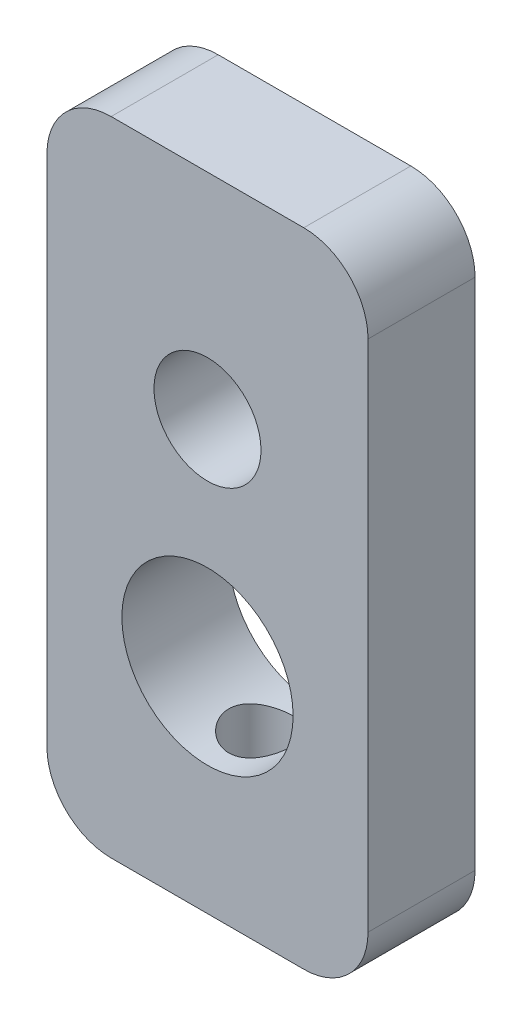
ISO-10303-21;
HEADER;
FILE_DESCRIPTION(('STEP AP214'),'2;1');
FILE_NAME('part.step','',(''),(''),'','','');
FILE_SCHEMA(('AUTOMOTIVE_DESIGN { 1 0 10303 214 1 1 1 1 }'));
ENDSEC;
DATA;
#1=APPLICATION_CONTEXT('core data for automotive mechanical design processes');
#2=APPLICATION_PROTOCOL_DEFINITION('international standard','automotive_design',2000,#1);
#3=PRODUCT_CONTEXT('',#1,'mechanical');
#4=PRODUCT('Part','Part','',(#3));
#5=PRODUCT_RELATED_PRODUCT_CATEGORY('part','',(#4));
#6=PRODUCT_DEFINITION_FORMATION('','',#4);
#7=PRODUCT_DEFINITION_CONTEXT('part definition',#1,'design');
#8=PRODUCT_DEFINITION('design','',#6,#7);
#9=PRODUCT_DEFINITION_SHAPE('','',#8);
#10=(LENGTH_UNIT() NAMED_UNIT(*) SI_UNIT(.MILLI.,.METRE.));
#11=(NAMED_UNIT(*) PLANE_ANGLE_UNIT() SI_UNIT($,.RADIAN.));
#12=(NAMED_UNIT(*) SI_UNIT($,.STERADIAN.) SOLID_ANGLE_UNIT());
#13=UNCERTAINTY_MEASURE_WITH_UNIT(LENGTH_MEASURE(1.E-05),#10,'distance_accuracy_value','');
#14=(GEOMETRIC_REPRESENTATION_CONTEXT(3) GLOBAL_UNCERTAINTY_ASSIGNED_CONTEXT((#13)) GLOBAL_UNIT_ASSIGNED_CONTEXT((#10,
#11,#12)) REPRESENTATION_CONTEXT('',''));
#15=CARTESIAN_POINT('',(0.,0.,0.));
#16=DIRECTION('',(0.,0.,1.));
#17=DIRECTION('',(1.,0.,0.));
#18=AXIS2_PLACEMENT_3D('',#15,#16,#17);
#19=CARTESIAN_POINT('',(0.,0.,5.));
#20=DIRECTION('',(0.,0.,1.));
#21=DIRECTION('',(1.,0.,0.));
#22=AXIS2_PLACEMENT_3D('',#19,#20,#21);
#23=PLANE('',#22);
#24=CARTESIAN_POINT('',(0.,0.,5.));
#25=DIRECTION('',(0.,0.,1.));
#26=DIRECTION('',(1.,0.,0.));
#27=AXIS2_PLACEMENT_3D('',#24,#25,#26);
#28=CIRCLE('',#27,4.);
#29=CARTESIAN_POINT('',(4.,0.,5.));
#30=VERTEX_POINT('',#29);
#31=EDGE_CURVE('E232',#30,#30,#28,.T.);
#32=ORIENTED_EDGE('',*,*,#31,.F.);
#33=EDGE_LOOP('',(#32));
#34=FACE_BOUND('',#33,.T.);
#35=DIRECTION('',(1.,0.,0.));
#36=VECTOR('',#35,1.);
#37=CARTESIAN_POINT('',(-7.5,-10.,5.));
#38=LINE('',#37,#36);
#39=CARTESIAN_POINT('',(-4.5,-10.,5.));
#40=VERTEX_POINT('',#39);
#41=CARTESIAN_POINT('',(4.5,-10.,5.));
#42=VERTEX_POINT('',#41);
#43=EDGE_CURVE('E223',#40,#42,#38,.T.);
#44=ORIENTED_EDGE('',*,*,#43,.T.);
#45=CARTESIAN_POINT('',(4.5,-7.,5.));
#46=DIRECTION('',(0.,0.,1.));
#47=DIRECTION('',(1.,0.,0.));
#48=AXIS2_PLACEMENT_3D('',#45,#46,#47);
#49=CIRCLE('',#48,3.);
#50=CARTESIAN_POINT('',(7.5,-7.,5.));
#51=VERTEX_POINT('',#50);
#52=EDGE_CURVE('E201',#42,#51,#49,.T.);
#53=ORIENTED_EDGE('',*,*,#52,.T.);
#54=DIRECTION('',(0.,1.,0.));
#55=VECTOR('',#54,1.);
#56=CARTESIAN_POINT('',(7.5,20.,5.));
#57=LINE('',#56,#55);
#58=CARTESIAN_POINT('',(7.5,17.,5.));
#59=VERTEX_POINT('',#58);
#60=EDGE_CURVE('E117',#51,#59,#57,.T.);
#61=ORIENTED_EDGE('',*,*,#60,.T.);
#62=CARTESIAN_POINT('',(4.5,17.,5.));
#63=DIRECTION('',(0.,0.,1.));
#64=DIRECTION('',(1.,0.,0.));
#65=AXIS2_PLACEMENT_3D('',#62,#63,#64);
#66=CIRCLE('',#65,3.);
#67=CARTESIAN_POINT('',(4.5,20.,5.));
#68=VERTEX_POINT('',#67);
#69=EDGE_CURVE('E53',#59,#68,#66,.T.);
#70=ORIENTED_EDGE('',*,*,#69,.T.);
#71=DIRECTION('',(-1.,0.,0.));
#72=VECTOR('',#71,1.);
#73=CARTESIAN_POINT('',(-7.5,20.,5.));
#74=LINE('',#73,#72);
#75=CARTESIAN_POINT('',(-4.5,20.,5.));
#76=VERTEX_POINT('',#75);
#77=EDGE_CURVE('E211',#68,#76,#74,.T.);
#78=ORIENTED_EDGE('',*,*,#77,.T.);
#79=CARTESIAN_POINT('',(-4.5,17.,5.));
#80=DIRECTION('',(0.,0.,1.));
#81=DIRECTION('',(1.,0.,0.));
#82=AXIS2_PLACEMENT_3D('',#79,#80,#81);
#83=CIRCLE('',#82,3.);
#84=CARTESIAN_POINT('',(-7.5,17.,5.));
#85=VERTEX_POINT('',#84);
#86=EDGE_CURVE('E194',#76,#85,#83,.T.);
#87=ORIENTED_EDGE('',*,*,#86,.T.);
#88=DIRECTION('',(0.,-1.,0.));
#89=VECTOR('',#88,1.);
#90=CARTESIAN_POINT('',(-7.5,20.,5.));
#91=LINE('',#90,#89);
#92=CARTESIAN_POINT('',(-7.5,-7.,5.));
#93=VERTEX_POINT('',#92);
#94=EDGE_CURVE('E127',#85,#93,#91,.T.);
#95=ORIENTED_EDGE('',*,*,#94,.T.);
#96=CARTESIAN_POINT('',(-4.5,-7.,5.));
#97=DIRECTION('',(0.,0.,1.));
#98=DIRECTION('',(1.,0.,0.));
#99=AXIS2_PLACEMENT_3D('',#96,#97,#98);
#100=CIRCLE('',#99,3.);
#101=EDGE_CURVE('E199',#93,#40,#100,.T.);
#102=ORIENTED_EDGE('',*,*,#101,.T.);
#103=EDGE_LOOP('',(#44,#53,#61,#70,#78,#87,#95,#102));
#104=FACE_BOUND('',#103,.T.);
#105=CARTESIAN_POINT('',(0.,10.,5.));
#106=DIRECTION('',(0.,0.,-1.));
#107=DIRECTION('',(-1.,0.,0.));
#108=AXIS2_PLACEMENT_3D('',#105,#106,#107);
#109=CIRCLE('',#108,2.5);
#110=CARTESIAN_POINT('',(-2.5,10.,5.));
#111=VERTEX_POINT('',#110);
#112=EDGE_CURVE('E242',#111,#111,#109,.T.);
#113=ORIENTED_EDGE('',*,*,#112,.T.);
#114=EDGE_LOOP('',(#113));
#115=FACE_BOUND('',#114,.T.);
#116=ADVANCED_FACE('F33',(#34,#104,#115),#23,.T.);
#117=CARTESIAN_POINT('',(0.,0.,0.));
#118=DIRECTION('',(0.,0.,1.));
#119=DIRECTION('',(1.,0.,0.));
#120=AXIS2_PLACEMENT_3D('',#117,#118,#119);
#121=PLANE('',#120);
#122=CARTESIAN_POINT('',(0.,0.,0.));
#123=DIRECTION('',(0.,0.,1.));
#124=DIRECTION('',(1.,0.,0.));
#125=AXIS2_PLACEMENT_3D('',#122,#123,#124);
#126=CIRCLE('',#125,4.);
#127=CARTESIAN_POINT('',(4.,0.,0.));
#128=VERTEX_POINT('',#127);
#129=EDGE_CURVE('E235',#128,#128,#126,.T.);
#130=ORIENTED_EDGE('',*,*,#129,.T.);
#131=EDGE_LOOP('',(#130));
#132=FACE_BOUND('',#131,.T.);
#133=DIRECTION('',(0.,1.,0.));
#134=VECTOR('',#133,1.);
#135=CARTESIAN_POINT('',(7.5,20.,0.));
#136=LINE('',#135,#134);
#137=CARTESIAN_POINT('',(7.5,-7.,0.));
#138=VERTEX_POINT('',#137);
#139=CARTESIAN_POINT('',(7.5,17.,0.));
#140=VERTEX_POINT('',#139);
#141=EDGE_CURVE('E115',#138,#140,#136,.T.);
#142=ORIENTED_EDGE('',*,*,#141,.F.);
#143=CARTESIAN_POINT('',(4.5,-7.,0.));
#144=DIRECTION('',(0.,0.,1.));
#145=DIRECTION('',(1.,0.,0.));
#146=AXIS2_PLACEMENT_3D('',#143,#144,#145);
#147=CIRCLE('',#146,3.);
#148=CARTESIAN_POINT('',(4.5,-10.,0.));
#149=VERTEX_POINT('',#148);
#150=EDGE_CURVE('E98',#138,#149,#147,.F.);
#151=ORIENTED_EDGE('',*,*,#150,.T.);
#152=DIRECTION('',(1.,0.,0.));
#153=VECTOR('',#152,1.);
#154=CARTESIAN_POINT('',(-7.5,-10.,0.));
#155=LINE('',#154,#153);
#156=CARTESIAN_POINT('',(-4.5,-10.,0.));
#157=VERTEX_POINT('',#156);
#158=EDGE_CURVE('E125',#157,#149,#155,.T.);
#159=ORIENTED_EDGE('',*,*,#158,.F.);
#160=CARTESIAN_POINT('',(-4.5,-7.,0.));
#161=DIRECTION('',(0.,0.,1.));
#162=DIRECTION('',(1.,0.,0.));
#163=AXIS2_PLACEMENT_3D('',#160,#161,#162);
#164=CIRCLE('',#163,3.);
#165=CARTESIAN_POINT('',(-7.5,-7.,0.));
#166=VERTEX_POINT('',#165);
#167=EDGE_CURVE('E109',#157,#166,#164,.F.);
#168=ORIENTED_EDGE('',*,*,#167,.T.);
#169=DIRECTION('',(0.,-1.,0.));
#170=VECTOR('',#169,1.);
#171=CARTESIAN_POINT('',(-7.5,20.,0.));
#172=LINE('',#171,#170);
#173=CARTESIAN_POINT('',(-7.5,17.,0.));
#174=VERTEX_POINT('',#173);
#175=EDGE_CURVE('E129',#174,#166,#172,.T.);
#176=ORIENTED_EDGE('',*,*,#175,.F.);
#177=CARTESIAN_POINT('',(-4.5,17.,0.));
#178=DIRECTION('',(0.,0.,1.));
#179=DIRECTION('',(1.,0.,0.));
#180=AXIS2_PLACEMENT_3D('',#177,#178,#179);
#181=CIRCLE('',#180,3.);
#182=CARTESIAN_POINT('',(-4.5,20.,0.));
#183=VERTEX_POINT('',#182);
#184=EDGE_CURVE('E213',#174,#183,#181,.F.);
#185=ORIENTED_EDGE('',*,*,#184,.T.);
#186=DIRECTION('',(-1.,0.,0.));
#187=VECTOR('',#186,1.);
#188=CARTESIAN_POINT('',(-7.5,20.,0.));
#189=LINE('',#188,#187);
#190=CARTESIAN_POINT('',(4.5,20.,0.));
#191=VERTEX_POINT('',#190);
#192=EDGE_CURVE('E124',#191,#183,#189,.T.);
#193=ORIENTED_EDGE('',*,*,#192,.F.);
#194=CARTESIAN_POINT('',(4.5,17.,0.));
#195=DIRECTION('',(0.,0.,1.));
#196=DIRECTION('',(1.,0.,0.));
#197=AXIS2_PLACEMENT_3D('',#194,#195,#196);
#198=CIRCLE('',#197,3.);
#199=EDGE_CURVE('E118',#191,#140,#198,.F.);
#200=ORIENTED_EDGE('',*,*,#199,.T.);
#201=EDGE_LOOP('',(#142,#151,#159,#168,#176,#185,#193,#200));
#202=FACE_BOUND('',#201,.T.);
#203=CARTESIAN_POINT('',(0.,10.,0.));
#204=DIRECTION('',(0.,0.,1.));
#205=DIRECTION('',(1.,0.,0.));
#206=AXIS2_PLACEMENT_3D('',#203,#204,#205);
#207=CIRCLE('',#206,2.5);
#208=CARTESIAN_POINT('',(2.5,10.,0.));
#209=VERTEX_POINT('',#208);
#210=EDGE_CURVE('E141',#209,#209,#207,.F.);
#211=ORIENTED_EDGE('',*,*,#210,.F.);
#212=EDGE_LOOP('',(#211));
#213=FACE_BOUND('',#212,.T.);
#214=ADVANCED_FACE('F121',(#132,#202,#213),#121,.F.);
#215=CARTESIAN_POINT('',(-7.5,20.,5.));
#216=DIRECTION('',(1.,0.,0.));
#217=DIRECTION('',(0.,1.,0.));
#218=AXIS2_PLACEMENT_3D('',#215,#216,#217);
#219=PLANE('',#218);
#220=ORIENTED_EDGE('',*,*,#175,.T.);
#221=DIRECTION('',(0.,0.,-1.));
#222=VECTOR('',#221,1.);
#223=CARTESIAN_POINT('',(-7.5,-7.,5.));
#224=LINE('',#223,#222);
#225=EDGE_CURVE('E208',#166,#93,#224,.F.);
#226=ORIENTED_EDGE('',*,*,#225,.T.);
#227=ORIENTED_EDGE('',*,*,#94,.F.);
#228=DIRECTION('',(0.,0.,-1.));
#229=VECTOR('',#228,1.);
#230=CARTESIAN_POINT('',(-7.5,17.,5.));
#231=LINE('',#230,#229);
#232=EDGE_CURVE('E196',#85,#174,#231,.T.);
#233=ORIENTED_EDGE('',*,*,#232,.T.);
#234=EDGE_LOOP('',(#220,#226,#227,#233));
#235=FACE_BOUND('',#234,.T.);
#236=ADVANCED_FACE('F166',(#235),#219,.F.);
#237=CARTESIAN_POINT('',(-7.5,-10.,5.));
#238=DIRECTION('',(0.,1.,0.));
#239=DIRECTION('',(0.,0.,1.));
#240=AXIS2_PLACEMENT_3D('',#237,#238,#239);
#241=PLANE('',#240);
#242=CARTESIAN_POINT('',(0.,-10.,2.5));
#243=DIRECTION('',(0.,1.,0.));
#244=DIRECTION('',(0.,0.,1.));
#245=AXIS2_PLACEMENT_3D('',#242,#243,#244);
#246=CIRCLE('',#245,1.5);
#247=CARTESIAN_POINT('',(0.,-10.,4.));
#248=VERTEX_POINT('',#247);
#249=EDGE_CURVE('E140',#248,#248,#246,.T.);
#250=ORIENTED_EDGE('',*,*,#249,.T.);
#251=EDGE_LOOP('',(#250));
#252=FACE_BOUND('',#251,.T.);
#253=ORIENTED_EDGE('',*,*,#158,.T.);
#254=DIRECTION('',(0.,0.,-1.));
#255=VECTOR('',#254,1.);
#256=CARTESIAN_POINT('',(4.5,-10.,5.));
#257=LINE('',#256,#255);
#258=EDGE_CURVE('E103',#149,#42,#257,.F.);
#259=ORIENTED_EDGE('',*,*,#258,.T.);
#260=ORIENTED_EDGE('',*,*,#43,.F.);
#261=DIRECTION('',(0.,0.,-1.));
#262=VECTOR('',#261,1.);
#263=CARTESIAN_POINT('',(-4.5,-10.,5.));
#264=LINE('',#263,#262);
#265=EDGE_CURVE('E108',#40,#157,#264,.T.);
#266=ORIENTED_EDGE('',*,*,#265,.T.);
#267=EDGE_LOOP('',(#253,#259,#260,#266));
#268=FACE_BOUND('',#267,.T.);
#269=ADVANCED_FACE('F176',(#252,#268),#241,.F.);
#270=CARTESIAN_POINT('',(7.5,20.,5.));
#271=DIRECTION('',(-1.,0.,0.));
#272=DIRECTION('',(0.,-1.,0.));
#273=AXIS2_PLACEMENT_3D('',#270,#271,#272);
#274=PLANE('',#273);
#275=ORIENTED_EDGE('',*,*,#60,.F.);
#276=DIRECTION('',(0.,0.,-1.));
#277=VECTOR('',#276,1.);
#278=CARTESIAN_POINT('',(7.5,-7.,5.));
#279=LINE('',#278,#277);
#280=EDGE_CURVE('E102',#51,#138,#279,.T.);
#281=ORIENTED_EDGE('',*,*,#280,.T.);
#282=ORIENTED_EDGE('',*,*,#141,.T.);
#283=DIRECTION('',(0.,0.,-1.));
#284=VECTOR('',#283,1.);
#285=CARTESIAN_POINT('',(7.5,17.,5.));
#286=LINE('',#285,#284);
#287=EDGE_CURVE('E119',#140,#59,#286,.F.);
#288=ORIENTED_EDGE('',*,*,#287,.T.);
#289=EDGE_LOOP('',(#275,#281,#282,#288));
#290=FACE_BOUND('',#289,.T.);
#291=ADVANCED_FACE('F114',(#290),#274,.F.);
#292=CARTESIAN_POINT('',(-7.5,20.,5.));
#293=DIRECTION('',(0.,-1.,0.));
#294=DIRECTION('',(0.,0.,-1.));
#295=AXIS2_PLACEMENT_3D('',#292,#293,#294);
#296=PLANE('',#295);
#297=ORIENTED_EDGE('',*,*,#192,.T.);
#298=DIRECTION('',(0.,0.,-1.));
#299=VECTOR('',#298,1.);
#300=CARTESIAN_POINT('',(-4.5,20.,5.));
#301=LINE('',#300,#299);
#302=EDGE_CURVE('E11',#183,#76,#301,.F.);
#303=ORIENTED_EDGE('',*,*,#302,.T.);
#304=ORIENTED_EDGE('',*,*,#77,.F.);
#305=DIRECTION('',(0.,0.,-1.));
#306=VECTOR('',#305,1.);
#307=CARTESIAN_POINT('',(4.5,20.,5.));
#308=LINE('',#307,#306);
#309=EDGE_CURVE('E41',#68,#191,#308,.T.);
#310=ORIENTED_EDGE('',*,*,#309,.T.);
#311=EDGE_LOOP('',(#297,#303,#304,#310));
#312=FACE_BOUND('',#311,.T.);
#313=ADVANCED_FACE('F171',(#312),#296,.F.);
#314=CARTESIAN_POINT('',(0.,0.,5.));
#315=DIRECTION('',(0.,0.,-1.));
#316=DIRECTION('',(-1.,0.,0.));
#317=AXIS2_PLACEMENT_3D('',#314,#315,#316);
#318=CYLINDRICAL_SURFACE('',#317,4.);
#319=CARTESIAN_POINT('',(0.,-4.,4.));
#320=CARTESIAN_POINT('',(0.081235058937853,-4.00000217456151,4.00000290230311));
#321=CARTESIAN_POINT('',(0.162450241781792,-3.99750379283184,3.99338023975162));
#322=CARTESIAN_POINT('',(0.322453452352361,-3.98778696006928,3.96717180473007));
#323=CARTESIAN_POINT('',(0.401241827987616,-3.98056918893993,3.94758789952943));
#324=CARTESIAN_POINT('',(0.554060784990879,-3.96218832391545,3.89624699822824));
#325=CARTESIAN_POINT('',(0.628100224162278,-3.9510328434944,3.86451348317821));
#326=CARTESIAN_POINT('',(0.769799310160254,-3.92588767765353,3.78989358698418));
#327=CARTESIAN_POINT('',(0.837457239177879,-3.91189723227548,3.74700421445585));
#328=CARTESIAN_POINT('',(0.967346417045826,-3.88186246971217,3.64938746892909));
#329=CARTESIAN_POINT('',(1.02927073015119,-3.86576002583566,3.5942697377406));
#330=CARTESIAN_POINT('',(1.14324421474363,-3.83360220871327,3.47458956534116));
#331=CARTESIAN_POINT('',(1.19529036359203,-3.81754685135033,3.41002424391213));
#332=CARTESIAN_POINT('',(1.28998202215985,-3.78662470617731,3.27028253247679));
#333=CARTESIAN_POINT('',(1.3321939319576,-3.77182648820818,3.19479563345418));
#334=CARTESIAN_POINT('',(1.40318646334084,-3.74599860237433,3.03715164583148));
#335=CARTESIAN_POINT('',(1.43197244961239,-3.73496742975881,2.9549972368449));
#336=CARTESIAN_POINT('',(1.47408431017549,-3.71854412824136,2.7898832597418));
#337=CARTESIAN_POINT('',(1.48799593218558,-3.71293924350838,2.70709496156456));
#338=CARTESIAN_POINT('',(1.50179556531648,-3.70738061461215,2.54018384200616));
#339=CARTESIAN_POINT('',(1.50168936802631,-3.70742453659305,2.45606158612553));
#340=CARTESIAN_POINT('',(1.48790429610018,-3.71297511632055,2.29423047478704));
#341=CARTESIAN_POINT('',(1.47503808509003,-3.71815468871122,2.21643909395582));
#342=CARTESIAN_POINT('',(1.4374416786833,-3.73284938059529,2.06421284959468));
#343=CARTESIAN_POINT('',(1.41270969663258,-3.74236515298863,1.98977849338612));
#344=CARTESIAN_POINT('',(1.35163748571904,-3.76485702190253,1.84472293227177));
#345=CARTESIAN_POINT('',(1.31508648737101,-3.77789517988166,1.7742005138787));
#346=CARTESIAN_POINT('',(1.23156073762698,-3.80594210139319,1.64005426240903));
#347=CARTESIAN_POINT('',(1.18458238728897,-3.82095154457158,1.5764328224803));
#348=CARTESIAN_POINT('',(1.07781780766549,-3.85248038859113,1.45339633634912));
#349=CARTESIAN_POINT('',(1.01738298716956,-3.86903347455671,1.39455135925191));
#350=CARTESIAN_POINT('',(0.887312590819021,-3.90091728164085,1.2876620337942));
#351=CARTESIAN_POINT('',(0.817675603497364,-3.91624781465952,1.23961934539433));
#352=CARTESIAN_POINT('',(0.66972343699242,-3.9442639480908,1.15506960293748));
#353=CARTESIAN_POINT('',(0.591290713844719,-3.95690498259616,1.11875241877894));
#354=CARTESIAN_POINT('',(0.428836850524583,-3.97778718326962,1.06001739572996));
#355=CARTESIAN_POINT('',(0.344818210845768,-3.98603030341493,1.03759338343888));
#356=CARTESIAN_POINT('',(0.178375243148666,-3.99684443228065,1.00837721245806));
#357=CARTESIAN_POINT('',(0.0961036195622098,-3.99969369025686,1.00081739361749));
#358=CARTESIAN_POINT('',(-0.068572475255024,-4.00025893700126,0.999308936100081));
#359=CARTESIAN_POINT('',(-0.150976912983373,-3.99797606386863,1.00535727968322));
#360=CARTESIAN_POINT('',(-0.310262048561859,-3.98871709772643,1.03031004230867));
#361=CARTESIAN_POINT('',(-0.387233328007336,-3.98192470962305,1.04871154373709));
#362=CARTESIAN_POINT('',(-0.536941754957221,-3.96451477091717,1.09718607254732));
#363=CARTESIAN_POINT('',(-0.609678350347534,-3.9538967228203,1.12726061794804));
#364=CARTESIAN_POINT('',(-0.751247765110155,-3.92949624407681,1.19918641243948));
#365=CARTESIAN_POINT('',(-0.819903083557795,-3.91563000209348,1.24135772922339));
#366=CARTESIAN_POINT('',(-0.949392711726625,-3.88626671564664,1.33591810317156));
#367=CARTESIAN_POINT('',(-1.01022412027045,-3.87076907009516,1.38831093254515));
#368=CARTESIAN_POINT('',(-1.12603079874454,-3.8387332949099,1.50540412212427));
#369=CARTESIAN_POINT('',(-1.18046154123569,-3.82218696503729,1.5706421827727));
#370=CARTESIAN_POINT('',(-1.27771050031903,-3.79078815746854,1.70965138470766));
#371=CARTESIAN_POINT('',(-1.32052767414518,-3.77593583194399,1.7834232913885));
#372=CARTESIAN_POINT('',(-1.39337773518998,-3.74966829822463,1.93801598677231));
#373=CARTESIAN_POINT('',(-1.42335685446918,-3.73826760328493,2.01886474591044));
#374=CARTESIAN_POINT('',(-1.46907883466889,-3.72054032891005,2.18500976368782));
#375=CARTESIAN_POINT('',(-1.48483050305535,-3.71421061057491,2.27030323619812));
#376=CARTESIAN_POINT('',(-1.50086347097839,-3.70775894792573,2.43701615954111));
#377=CARTESIAN_POINT('',(-1.50207331495837,-3.70726444523341,2.51833263171689));
#378=CARTESIAN_POINT('',(-1.49136715641593,-3.71158412745292,2.67994531627617));
#379=CARTESIAN_POINT('',(-1.47945239850124,-3.71639780898899,2.76024162467158));
#380=CARTESIAN_POINT('',(-1.44355815630242,-3.73048141585432,2.91504722671655));
#381=CARTESIAN_POINT('',(-1.41995798316524,-3.73961085376663,2.98965834624535));
#382=CARTESIAN_POINT('',(-1.3616969677992,-3.76121548297845,3.13390550849442));
#383=CARTESIAN_POINT('',(-1.32703332944945,-3.77369151995215,3.20354028807014));
#384=CARTESIAN_POINT('',(-1.24552075938154,-3.80139723903964,3.33982678969763));
#385=CARTESIAN_POINT('',(-1.1981283280301,-3.81673698440964,3.40613079679991));
#386=CARTESIAN_POINT('',(-1.09334485729906,-3.84806246757177,3.5301415609712));
#387=CARTESIAN_POINT('',(-1.03595064012808,-3.86404840943145,3.58784557478675));
#388=CARTESIAN_POINT('',(-0.909080396784623,-3.89590424609881,3.69620195582184));
#389=CARTESIAN_POINT('',(-0.839118644212992,-3.91172104900645,3.74630375343467));
#390=CARTESIAN_POINT('',(-0.69121322320082,-3.94054514457031,3.83402265527656));
#391=CARTESIAN_POINT('',(-0.613268934090621,-3.95355221851559,3.87163878773637));
#392=CARTESIAN_POINT('',(-0.447999082002312,-3.9757429260668,3.93437682904833));
#393=CARTESIAN_POINT('',(-0.360413422234208,-3.98473657158356,3.9588870646019));
#394=CARTESIAN_POINT('',(-0.181875733606382,-3.99686242179587,3.99169295992068));
#395=CARTESIAN_POINT('',(-0.0909254163648589,-3.99999756603967,3.99999675148732));
#396=CARTESIAN_POINT('',(0.,-4.,4.));
#397=B_SPLINE_CURVE_WITH_KNOTS('',3,(#319,#320,#321,#322,#323,#324,#325,#326,#327,#328,#329,
#330,#331,#332,#333,#334,#335,#336,#337,#338,#339,#340,#341,#342,#343,#344,#345,#346,#347,#348,
#349,#350,#351,#352,#353,#354,#355,#356,#357,#358,#359,#360,#361,#362,#363,#364,#365,#366,#367,
#368,#369,#370,#371,#372,#373,#374,#375,#376,#377,#378,#379,#380,#381,#382,#383,#384,#385,#386,
#387,#388,#389,#390,#391,#392,#393,#394,#395,#396),.UNSPECIFIED.,.T.,.F.,(4,2,2,2,2,2,2,2,2,2,2,
2,2,2,2,2,2,2,2,2,2,2,2,2,2,2,2,2,2,2,2,2,2,2,2,2,2,2,4),(0.,0.24336980156056,0.48670454953046,
0.729571369213573,0.97250337960949,1.22473618582715,1.47704604925622,1.73896674501659,
2.00078269352134,2.25185874416901,2.50283106079707,2.73878345119971,2.97477138060589,
3.21522408387018,3.45575990744259,3.71246153335813,3.96920257905066,4.22991375286075,
4.49050899698846,4.73725019635925,4.98393668390521,5.2211443792384,5.45838293254453,
5.702592218596,5.94689180019868,6.20536519455658,6.46386178920141,6.72343066727204,
6.98283874956507,7.22558763480252,7.46831350211259,7.70363142426533,7.93900886656507,
8.18672471884271,8.43451941997062,8.69572329654039,8.95694749805102,9.22948515032042,
9.50188601796128),.UNSPECIFIED.);
#398=CARTESIAN_POINT('',(0.,-4.,4.));
#399=VERTEX_POINT('',#398);
#400=EDGE_CURVE('E133',#399,#399,#397,.T.);
#401=ORIENTED_EDGE('',*,*,#400,.F.);
#402=EDGE_LOOP('',(#401));
#403=FACE_BOUND('',#402,.T.);
#404=ORIENTED_EDGE('',*,*,#31,.T.);
#405=EDGE_LOOP('',(#404));
#406=FACE_BOUND('',#405,.T.);
#407=ORIENTED_EDGE('',*,*,#129,.F.);
#408=EDGE_LOOP('',(#407));
#409=FACE_BOUND('',#408,.T.);
#410=ADVANCED_FACE('F143',(#403,#406,#409),#318,.F.);
#411=CARTESIAN_POINT('',(0.,-30.,2.5));
#412=DIRECTION('',(0.,1.,0.));
#413=DIRECTION('',(0.,0.,1.));
#414=AXIS2_PLACEMENT_3D('',#411,#412,#413);
#415=CYLINDRICAL_SURFACE('',#414,1.5);
#416=ORIENTED_EDGE('',*,*,#400,.T.);
#417=EDGE_LOOP('',(#416));
#418=FACE_BOUND('',#417,.T.);
#419=ORIENTED_EDGE('',*,*,#249,.F.);
#420=EDGE_LOOP('',(#419));
#421=FACE_BOUND('',#420,.T.);
#422=ADVANCED_FACE('F146',(#418,#421),#415,.F.);
#423=CARTESIAN_POINT('',(0.,10.,-5.));
#424=DIRECTION('',(0.,0.,1.));
#425=DIRECTION('',(1.,0.,0.));
#426=AXIS2_PLACEMENT_3D('',#423,#424,#425);
#427=CYLINDRICAL_SURFACE('',#426,2.5);
#428=ORIENTED_EDGE('',*,*,#112,.F.);
#429=EDGE_LOOP('',(#428));
#430=FACE_BOUND('',#429,.T.);
#431=ORIENTED_EDGE('',*,*,#210,.T.);
#432=EDGE_LOOP('',(#431));
#433=FACE_BOUND('',#432,.T.);
#434=ADVANCED_FACE('F150',(#430,#433),#427,.F.);
#435=CARTESIAN_POINT('',(4.5,-7.,5.));
#436=DIRECTION('',(0.,0.,-1.));
#437=DIRECTION('',(-1.,0.,0.));
#438=AXIS2_PLACEMENT_3D('',#435,#436,#437);
#439=CYLINDRICAL_SURFACE('',#438,3.);
#440=ORIENTED_EDGE('',*,*,#52,.F.);
#441=ORIENTED_EDGE('',*,*,#258,.F.);
#442=ORIENTED_EDGE('',*,*,#150,.F.);
#443=ORIENTED_EDGE('',*,*,#280,.F.);
#444=EDGE_LOOP('',(#440,#441,#442,#443));
#445=FACE_BOUND('',#444,.T.);
#446=ADVANCED_FACE('F101',(#445),#439,.T.);
#447=CARTESIAN_POINT('',(-4.5,-7.,5.));
#448=DIRECTION('',(0.,0.,-1.));
#449=DIRECTION('',(-1.,0.,0.));
#450=AXIS2_PLACEMENT_3D('',#447,#448,#449);
#451=CYLINDRICAL_SURFACE('',#450,3.);
#452=ORIENTED_EDGE('',*,*,#101,.F.);
#453=ORIENTED_EDGE('',*,*,#225,.F.);
#454=ORIENTED_EDGE('',*,*,#167,.F.);
#455=ORIENTED_EDGE('',*,*,#265,.F.);
#456=EDGE_LOOP('',(#452,#453,#454,#455));
#457=FACE_BOUND('',#456,.T.);
#458=ADVANCED_FACE('F157',(#457),#451,.T.);
#459=CARTESIAN_POINT('',(-4.5,17.,5.));
#460=DIRECTION('',(0.,0.,-1.));
#461=DIRECTION('',(-1.,0.,0.));
#462=AXIS2_PLACEMENT_3D('',#459,#460,#461);
#463=CYLINDRICAL_SURFACE('',#462,3.);
#464=ORIENTED_EDGE('',*,*,#86,.F.);
#465=ORIENTED_EDGE('',*,*,#302,.F.);
#466=ORIENTED_EDGE('',*,*,#184,.F.);
#467=ORIENTED_EDGE('',*,*,#232,.F.);
#468=EDGE_LOOP('',(#464,#465,#466,#467));
#469=FACE_BOUND('',#468,.T.);
#470=ADVANCED_FACE('F184',(#469),#463,.T.);
#471=CARTESIAN_POINT('',(4.5,17.,5.));
#472=DIRECTION('',(0.,0.,-1.));
#473=DIRECTION('',(-1.,0.,0.));
#474=AXIS2_PLACEMENT_3D('',#471,#472,#473);
#475=CYLINDRICAL_SURFACE('',#474,3.);
#476=ORIENTED_EDGE('',*,*,#69,.F.);
#477=ORIENTED_EDGE('',*,*,#287,.F.);
#478=ORIENTED_EDGE('',*,*,#199,.F.);
#479=ORIENTED_EDGE('',*,*,#309,.F.);
#480=EDGE_LOOP('',(#476,#477,#478,#479));
#481=FACE_BOUND('',#480,.T.);
#482=ADVANCED_FACE('F35',(#481),#475,.T.);
#483=CLOSED_SHELL('',(#116,#214,#236,#269,#291,#313,#410,#422,#434,#446,#458,#470,#482));
#484=MANIFOLD_SOLID_BREP('B2',#483);
#485=ADVANCED_BREP_SHAPE_REPRESENTATION('',(#18,#484),#14);
#486=SHAPE_DEFINITION_REPRESENTATION(#9,#485);
ENDSEC;
END-ISO-10303-21;
